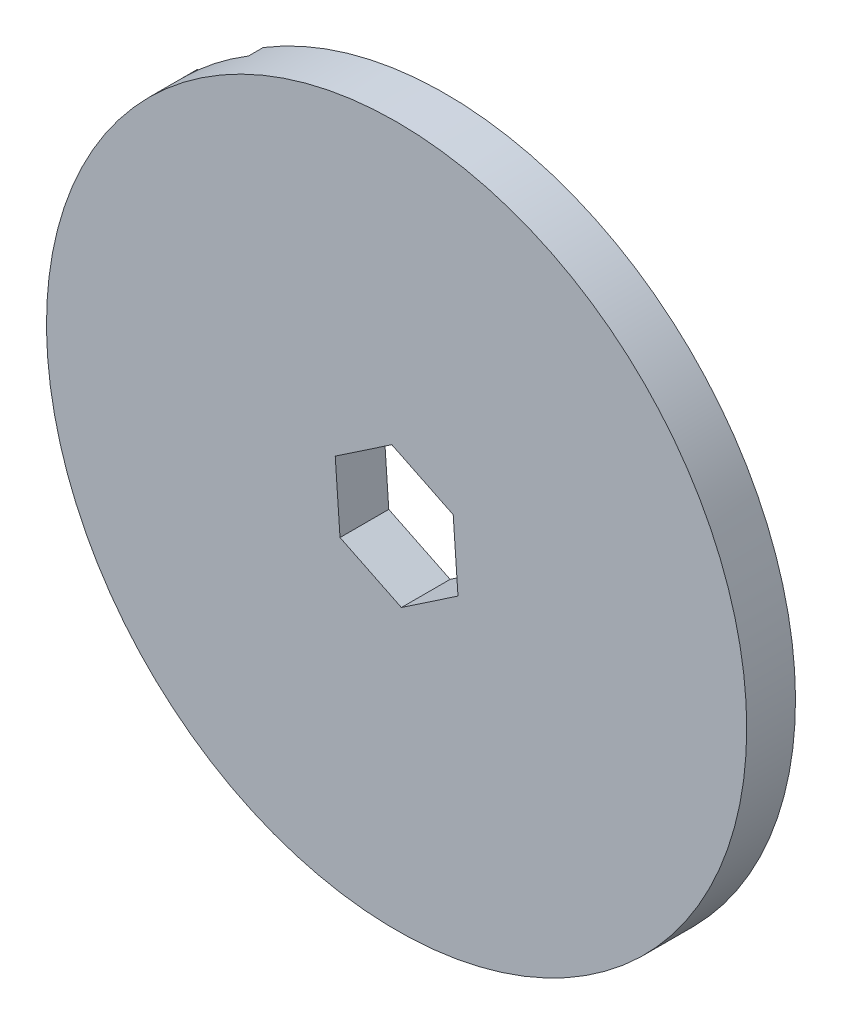
ISO-10303-21;
HEADER;
FILE_DESCRIPTION(('STEP AP214'),'2;1');
FILE_NAME('part.step','',(''),(''),'','','');
FILE_SCHEMA(('AUTOMOTIVE_DESIGN { 1 0 10303 214 1 1 1 1 }'));
ENDSEC;
DATA;
#1=APPLICATION_CONTEXT('core data for automotive mechanical design processes');
#2=APPLICATION_PROTOCOL_DEFINITION('international standard','automotive_design',2000,#1);
#3=PRODUCT_CONTEXT('',#1,'mechanical');
#4=PRODUCT('Part','Part','',(#3));
#5=PRODUCT_RELATED_PRODUCT_CATEGORY('part','',(#4));
#6=PRODUCT_DEFINITION_FORMATION('','',#4);
#7=PRODUCT_DEFINITION_CONTEXT('part definition',#1,'design');
#8=PRODUCT_DEFINITION('design','',#6,#7);
#9=PRODUCT_DEFINITION_SHAPE('','',#8);
#10=(LENGTH_UNIT() NAMED_UNIT(*) SI_UNIT(.MILLI.,.METRE.));
#11=(NAMED_UNIT(*) PLANE_ANGLE_UNIT() SI_UNIT($,.RADIAN.));
#12=(NAMED_UNIT(*) SI_UNIT($,.STERADIAN.) SOLID_ANGLE_UNIT());
#13=UNCERTAINTY_MEASURE_WITH_UNIT(LENGTH_MEASURE(1.E-05),#10,'distance_accuracy_value','');
#14=(GEOMETRIC_REPRESENTATION_CONTEXT(3) GLOBAL_UNCERTAINTY_ASSIGNED_CONTEXT((#13)) GLOBAL_UNIT_ASSIGNED_CONTEXT((#10,
#11,#12)) REPRESENTATION_CONTEXT('',''));
#15=CARTESIAN_POINT('',(0.,0.,0.));
#16=DIRECTION('',(0.,0.,1.));
#17=DIRECTION('',(1.,0.,0.));
#18=AXIS2_PLACEMENT_3D('',#15,#16,#17);
#19=CARTESIAN_POINT('',(0.,0.,5.));
#20=DIRECTION('',(0.,0.,1.));
#21=DIRECTION('',(1.,0.,0.));
#22=AXIS2_PLACEMENT_3D('',#19,#20,#21);
#23=PLANE('',#22);
#24=CARTESIAN_POINT('',(0.,0.,5.));
#25=DIRECTION('',(0.,0.,1.));
#26=DIRECTION('',(1.,0.,0.));
#27=AXIS2_PLACEMENT_3D('',#24,#25,#26);
#28=CIRCLE('',#27,35.9);
#29=CARTESIAN_POINT('',(35.9,0.,5.));
#30=VERTEX_POINT('',#29);
#31=EDGE_CURVE('E11',#30,#30,#28,.T.);
#32=ORIENTED_EDGE('',*,*,#31,.T.);
#33=EDGE_LOOP('',(#32));
#34=FACE_BOUND('',#33,.T.);
#35=DIRECTION('',(-0.0701147001181116,0.997538935995657,0.));
#36=VECTOR('',#35,1.);
#37=CARTESIAN_POINT('',(6.29265986926775,-3.06633849561771,5.));
#38=LINE('',#37,#36);
#39=CARTESIAN_POINT('',(6.29265986926775,-3.06633849561771,5.));
#40=VERTEX_POINT('',#39);
#41=CARTESIAN_POINT('',(5.80185696844097,3.91643405635189,5.));
#42=VERTEX_POINT('',#41);
#43=EDGE_CURVE('E202',#40,#42,#38,.T.);
#44=ORIENTED_EDGE('',*,*,#43,.F.);
#45=DIRECTION('',(0.828836709777282,0.559490579478841,0.));
#46=VECTOR('',#45,1.);
#47=CARTESIAN_POINT('',(0.490802900826781,-6.9827725519696,5.));
#48=LINE('',#47,#46);
#49=CARTESIAN_POINT('',(0.490802900826781,-6.9827725519696,5.));
#50=VERTEX_POINT('',#49);
#51=EDGE_CURVE('E200',#50,#40,#48,.T.);
#52=ORIENTED_EDGE('',*,*,#51,.F.);
#53=DIRECTION('',(0.898951409895394,-0.438048356516816,0.));
#54=VECTOR('',#53,1.);
#55=CARTESIAN_POINT('',(-5.80185696844098,-3.91643405635189,5.));
#56=LINE('',#55,#54);
#57=CARTESIAN_POINT('',(-5.80185696844098,-3.91643405635189,5.));
#58=VERTEX_POINT('',#57);
#59=EDGE_CURVE('E212',#58,#50,#56,.T.);
#60=ORIENTED_EDGE('',*,*,#59,.F.);
#61=DIRECTION('',(0.0701147001181116,-0.997538935995657,0.));
#62=VECTOR('',#61,1.);
#63=CARTESIAN_POINT('',(-6.29265986926776,3.06633849561771,5.));
#64=LINE('',#63,#62);
#65=CARTESIAN_POINT('',(-6.29265986926776,3.06633849561771,5.));
#66=VERTEX_POINT('',#65);
#67=EDGE_CURVE('E209',#66,#58,#64,.T.);
#68=ORIENTED_EDGE('',*,*,#67,.F.);
#69=DIRECTION('',(-0.828836709777282,-0.559490579478841,0.));
#70=VECTOR('',#69,1.);
#71=CARTESIAN_POINT('',(-0.490802900826782,6.9827725519696,5.));
#72=LINE('',#71,#70);
#73=CARTESIAN_POINT('',(-0.490802900826782,6.9827725519696,5.));
#74=VERTEX_POINT('',#73);
#75=EDGE_CURVE('E207',#74,#66,#72,.T.);
#76=ORIENTED_EDGE('',*,*,#75,.F.);
#77=DIRECTION('',(-0.898951409895394,0.438048356516816,0.));
#78=VECTOR('',#77,1.);
#79=CARTESIAN_POINT('',(5.80185696844097,3.91643405635189,5.));
#80=LINE('',#79,#78);
#81=EDGE_CURVE('E205',#42,#74,#80,.T.);
#82=ORIENTED_EDGE('',*,*,#81,.F.);
#83=EDGE_LOOP('',(#44,#52,#60,#68,#76,#82));
#84=FACE_BOUND('',#83,.T.);
#85=ADVANCED_FACE('F43',(#34,#84),#23,.T.);
#86=CARTESIAN_POINT('',(0.,0.,0.));
#87=DIRECTION('',(0.,0.,1.));
#88=DIRECTION('',(1.,0.,0.));
#89=AXIS2_PLACEMENT_3D('',#86,#87,#88);
#90=PLANE('',#89);
#91=CARTESIAN_POINT('',(0.,0.,0.));
#92=DIRECTION('',(0.,0.,1.));
#93=DIRECTION('',(1.,0.,0.));
#94=AXIS2_PLACEMENT_3D('',#91,#92,#93);
#95=CIRCLE('',#94,35.9);
#96=CARTESIAN_POINT('',(25.4038190708252,-25.3664340540167,0.));
#97=VERTEX_POINT('',#96);
#98=CARTESIAN_POINT('',(-18.6822614231694,30.6558821128402,0.));
#99=VERTEX_POINT('',#98);
#100=EDGE_CURVE('E243',#97,#99,#95,.T.);
#101=ORIENTED_EDGE('',*,*,#100,.F.);
#102=DIRECTION('',(0.676047817007071,-0.73685775365397,0.));
#103=VECTOR('',#102,1.);
#104=CARTESIAN_POINT('',(21.4105641636638,-21.0139892022823,0.));
#105=LINE('',#104,#103);
#106=CARTESIAN_POINT('',(21.4105641636638,-21.0139892022823,0.));
#107=VERTEX_POINT('',#106);
#108=EDGE_CURVE('E162',#107,#97,#105,.T.);
#109=ORIENTED_EDGE('',*,*,#108,.F.);
#110=CARTESIAN_POINT('',(0.,0.,0.));
#111=DIRECTION('',(0.,0.,1.));
#112=DIRECTION('',(-1.,0.,0.));
#113=AXIS2_PLACEMENT_3D('',#110,#111,#112);
#114=CIRCLE('',#113,30.);
#115=CARTESIAN_POINT('',(15.2421962619728,-25.8394166557897,0.));
#116=VERTEX_POINT('',#115);
#117=EDGE_CURVE('E266',#116,#107,#114,.T.);
#118=ORIENTED_EDGE('',*,*,#117,.F.);
#119=DIRECTION('',(-0.581208288475088,0.813754831265449,0.));
#120=VECTOR('',#119,1.);
#121=CARTESIAN_POINT('',(18.6822614231694,-30.6558821128402,0.));
#122=LINE('',#121,#120);
#123=CARTESIAN_POINT('',(18.6822614231694,-30.6558821128402,0.));
#124=VERTEX_POINT('',#123);
#125=EDGE_CURVE('E264',#124,#116,#122,.T.);
#126=ORIENTED_EDGE('',*,*,#125,.F.);
#127=CARTESIAN_POINT('',(-25.4038190708252,25.3664340540167,0.));
#128=VERTEX_POINT('',#127);
#129=EDGE_CURVE('E47',#128,#124,#95,.T.);
#130=ORIENTED_EDGE('',*,*,#129,.F.);
#131=DIRECTION('',(-0.676047817007071,0.73685775365397,0.));
#132=VECTOR('',#131,1.);
#133=CARTESIAN_POINT('',(-21.4105641636638,21.0139892022823,0.));
#134=LINE('',#133,#132);
#135=CARTESIAN_POINT('',(-21.4105641636638,21.0139892022823,0.));
#136=VERTEX_POINT('',#135);
#137=EDGE_CURVE('E176',#136,#128,#134,.T.);
#138=ORIENTED_EDGE('',*,*,#137,.F.);
#139=CARTESIAN_POINT('',(0.,0.,0.));
#140=DIRECTION('',(0.,0.,1.));
#141=DIRECTION('',(1.,0.,0.));
#142=AXIS2_PLACEMENT_3D('',#139,#140,#141);
#143=CIRCLE('',#142,30.);
#144=CARTESIAN_POINT('',(-15.2421962619728,25.8394166557897,0.));
#145=VERTEX_POINT('',#144);
#146=EDGE_CURVE('E186',#145,#136,#143,.T.);
#147=ORIENTED_EDGE('',*,*,#146,.F.);
#148=DIRECTION('',(0.581208288475088,-0.813754831265449,0.));
#149=VECTOR('',#148,1.);
#150=CARTESIAN_POINT('',(-18.6822614231694,30.6558821128402,0.));
#151=LINE('',#150,#149);
#152=EDGE_CURVE('E183',#99,#145,#151,.T.);
#153=ORIENTED_EDGE('',*,*,#152,.F.);
#154=EDGE_LOOP('',(#101,#109,#118,#126,#130,#138,#147,#153));
#155=FACE_BOUND('',#154,.T.);
#156=DIRECTION('',(0.828836709777282,0.559490579478841,0.));
#157=VECTOR('',#156,1.);
#158=CARTESIAN_POINT('',(0.490802900826781,-6.9827725519696,0.));
#159=LINE('',#158,#157);
#160=CARTESIAN_POINT('',(0.490802900826781,-6.9827725519696,0.));
#161=VERTEX_POINT('',#160);
#162=CARTESIAN_POINT('',(6.29265986926775,-3.06633849561771,0.));
#163=VERTEX_POINT('',#162);
#164=EDGE_CURVE('E193',#161,#163,#159,.T.);
#165=ORIENTED_EDGE('',*,*,#164,.T.);
#166=DIRECTION('',(-0.0701147001181116,0.997538935995657,0.));
#167=VECTOR('',#166,1.);
#168=CARTESIAN_POINT('',(6.29265986926775,-3.06633849561771,0.));
#169=LINE('',#168,#167);
#170=CARTESIAN_POINT('',(5.80185696844097,3.91643405635189,0.));
#171=VERTEX_POINT('',#170);
#172=EDGE_CURVE('E217',#163,#171,#169,.T.);
#173=ORIENTED_EDGE('',*,*,#172,.T.);
#174=DIRECTION('',(-0.898951409895394,0.438048356516816,0.));
#175=VECTOR('',#174,1.);
#176=CARTESIAN_POINT('',(5.80185696844097,3.91643405635189,0.));
#177=LINE('',#176,#175);
#178=CARTESIAN_POINT('',(-0.490802900826782,6.9827725519696,0.));
#179=VERTEX_POINT('',#178);
#180=EDGE_CURVE('E220',#171,#179,#177,.T.);
#181=ORIENTED_EDGE('',*,*,#180,.T.);
#182=DIRECTION('',(-0.828836709777282,-0.559490579478841,0.));
#183=VECTOR('',#182,1.);
#184=CARTESIAN_POINT('',(-0.490802900826782,6.9827725519696,0.));
#185=LINE('',#184,#183);
#186=CARTESIAN_POINT('',(-6.29265986926776,3.06633849561771,0.));
#187=VERTEX_POINT('',#186);
#188=EDGE_CURVE('E223',#179,#187,#185,.T.);
#189=ORIENTED_EDGE('',*,*,#188,.T.);
#190=DIRECTION('',(0.0701147001181116,-0.997538935995657,0.));
#191=VECTOR('',#190,1.);
#192=CARTESIAN_POINT('',(-6.29265986926776,3.06633849561771,0.));
#193=LINE('',#192,#191);
#194=CARTESIAN_POINT('',(-5.80185696844098,-3.91643405635189,0.));
#195=VERTEX_POINT('',#194);
#196=EDGE_CURVE('E226',#187,#195,#193,.T.);
#197=ORIENTED_EDGE('',*,*,#196,.T.);
#198=DIRECTION('',(0.898951409895394,-0.438048356516816,0.));
#199=VECTOR('',#198,1.);
#200=CARTESIAN_POINT('',(-5.80185696844098,-3.91643405635189,0.));
#201=LINE('',#200,#199);
#202=EDGE_CURVE('E203',#195,#161,#201,.T.);
#203=ORIENTED_EDGE('',*,*,#202,.T.);
#204=EDGE_LOOP('',(#165,#173,#181,#189,#197,#203));
#205=FACE_BOUND('',#204,.T.);
#206=ADVANCED_FACE('F255',(#155,#205),#90,.F.);
#207=CARTESIAN_POINT('',(0.,0.,5.));
#208=DIRECTION('',(0.,0.,-1.));
#209=DIRECTION('',(-1.,0.,0.));
#210=AXIS2_PLACEMENT_3D('',#207,#208,#209);
#211=CYLINDRICAL_SURFACE('',#210,35.9);
#212=ORIENTED_EDGE('',*,*,#31,.F.);
#213=EDGE_LOOP('',(#212));
#214=FACE_BOUND('',#213,.T.);
#215=CARTESIAN_POINT('',(0.,0.,1.5));
#216=DIRECTION('',(0.,0.,-1.));
#217=DIRECTION('',(-1.,0.,0.));
#218=AXIS2_PLACEMENT_3D('',#215,#216,#217);
#219=CIRCLE('',#218,35.9);
#220=CARTESIAN_POINT('',(25.4038190708252,-25.3664340540167,1.5));
#221=VERTEX_POINT('',#220);
#222=CARTESIAN_POINT('',(18.6822614231694,-30.6558821128402,1.5));
#223=VERTEX_POINT('',#222);
#224=EDGE_CURVE('E156',#221,#223,#219,.T.);
#225=ORIENTED_EDGE('',*,*,#224,.F.);
#226=DIRECTION('',(0.,0.,-1.));
#227=VECTOR('',#226,1.);
#228=CARTESIAN_POINT('',(25.4038190708252,-25.3664340540167,1.5));
#229=LINE('',#228,#227);
#230=EDGE_CURVE('E187',#221,#97,#229,.T.);
#231=ORIENTED_EDGE('',*,*,#230,.T.);
#232=ORIENTED_EDGE('',*,*,#100,.T.);
#233=DIRECTION('',(0.,0.,-1.));
#234=VECTOR('',#233,1.);
#235=CARTESIAN_POINT('',(-18.6822614231694,30.6558821128402,1.5));
#236=LINE('',#235,#234);
#237=CARTESIAN_POINT('',(-18.6822614231694,30.6558821128402,1.5));
#238=VERTEX_POINT('',#237);
#239=EDGE_CURVE('E182',#238,#99,#236,.T.);
#240=ORIENTED_EDGE('',*,*,#239,.F.);
#241=CARTESIAN_POINT('',(0.,0.,1.5));
#242=DIRECTION('',(0.,0.,-1.));
#243=DIRECTION('',(1.,0.,0.));
#244=AXIS2_PLACEMENT_3D('',#241,#242,#243);
#245=CIRCLE('',#244,35.9);
#246=CARTESIAN_POINT('',(-25.4038190708252,25.3664340540167,1.5));
#247=VERTEX_POINT('',#246);
#248=EDGE_CURVE('E173',#247,#238,#245,.T.);
#249=ORIENTED_EDGE('',*,*,#248,.F.);
#250=DIRECTION('',(0.,0.,-1.));
#251=VECTOR('',#250,1.);
#252=CARTESIAN_POINT('',(-25.4038190708252,25.3664340540167,1.5));
#253=LINE('',#252,#251);
#254=EDGE_CURVE('E191',#247,#128,#253,.T.);
#255=ORIENTED_EDGE('',*,*,#254,.T.);
#256=ORIENTED_EDGE('',*,*,#129,.T.);
#257=DIRECTION('',(0.,0.,-1.));
#258=VECTOR('',#257,1.);
#259=CARTESIAN_POINT('',(18.6822614231694,-30.6558821128402,1.5));
#260=LINE('',#259,#258);
#261=EDGE_CURVE('E151',#223,#124,#260,.T.);
#262=ORIENTED_EDGE('',*,*,#261,.F.);
#263=EDGE_LOOP('',(#225,#231,#232,#240,#249,#255,#256,#262));
#264=FACE_BOUND('',#263,.T.);
#265=ADVANCED_FACE('F45',(#214,#264),#211,.T.);
#266=CARTESIAN_POINT('',(0.490802900826781,-6.9827725519696,5.));
#267=DIRECTION('',(-0.559490579478841,0.828836709777282,0.));
#268=DIRECTION('',(-0.828836709777282,-0.559490579478841,0.));
#269=AXIS2_PLACEMENT_3D('',#266,#267,#268);
#270=PLANE('',#269);
#271=ORIENTED_EDGE('',*,*,#164,.F.);
#272=DIRECTION('',(0.,0.,-1.));
#273=VECTOR('',#272,1.);
#274=CARTESIAN_POINT('',(0.490802900826781,-6.9827725519696,5.));
#275=LINE('',#274,#273);
#276=EDGE_CURVE('E214',#50,#161,#275,.T.);
#277=ORIENTED_EDGE('',*,*,#276,.F.);
#278=ORIENTED_EDGE('',*,*,#51,.T.);
#279=DIRECTION('',(0.,0.,-1.));
#280=VECTOR('',#279,1.);
#281=CARTESIAN_POINT('',(6.29265986926775,-3.06633849561771,5.));
#282=LINE('',#281,#280);
#283=EDGE_CURVE('E241',#40,#163,#282,.T.);
#284=ORIENTED_EDGE('',*,*,#283,.T.);
#285=EDGE_LOOP('',(#271,#277,#278,#284));
#286=FACE_BOUND('',#285,.T.);
#287=ADVANCED_FACE('F293',(#286),#270,.T.);
#288=CARTESIAN_POINT('',(6.29265986926775,-3.06633849561771,5.));
#289=DIRECTION('',(-0.997538935995657,-0.0701147001181116,0.));
#290=DIRECTION('',(0.0701147001181116,-0.997538935995657,0.));
#291=AXIS2_PLACEMENT_3D('',#288,#289,#290);
#292=PLANE('',#291);
#293=ORIENTED_EDGE('',*,*,#172,.F.);
#294=ORIENTED_EDGE('',*,*,#283,.F.);
#295=ORIENTED_EDGE('',*,*,#43,.T.);
#296=DIRECTION('',(0.,0.,-1.));
#297=VECTOR('',#296,1.);
#298=CARTESIAN_POINT('',(5.80185696844097,3.91643405635189,5.));
#299=LINE('',#298,#297);
#300=EDGE_CURVE('E239',#42,#171,#299,.T.);
#301=ORIENTED_EDGE('',*,*,#300,.T.);
#302=EDGE_LOOP('',(#293,#294,#295,#301));
#303=FACE_BOUND('',#302,.T.);
#304=ADVANCED_FACE('F295',(#303),#292,.T.);
#305=CARTESIAN_POINT('',(5.80185696844097,3.91643405635189,5.));
#306=DIRECTION('',(-0.438048356516816,-0.898951409895394,0.));
#307=DIRECTION('',(0.898951409895394,-0.438048356516816,0.));
#308=AXIS2_PLACEMENT_3D('',#305,#306,#307);
#309=PLANE('',#308);
#310=ORIENTED_EDGE('',*,*,#180,.F.);
#311=ORIENTED_EDGE('',*,*,#300,.F.);
#312=ORIENTED_EDGE('',*,*,#81,.T.);
#313=DIRECTION('',(0.,0.,-1.));
#314=VECTOR('',#313,1.);
#315=CARTESIAN_POINT('',(-0.490802900826782,6.9827725519696,5.));
#316=LINE('',#315,#314);
#317=EDGE_CURVE('E237',#74,#179,#316,.T.);
#318=ORIENTED_EDGE('',*,*,#317,.T.);
#319=EDGE_LOOP('',(#310,#311,#312,#318));
#320=FACE_BOUND('',#319,.T.);
#321=ADVANCED_FACE('F298',(#320),#309,.T.);
#322=CARTESIAN_POINT('',(-0.490802900826782,6.9827725519696,5.));
#323=DIRECTION('',(0.559490579478841,-0.828836709777282,0.));
#324=DIRECTION('',(0.828836709777282,0.559490579478841,0.));
#325=AXIS2_PLACEMENT_3D('',#322,#323,#324);
#326=PLANE('',#325);
#327=ORIENTED_EDGE('',*,*,#188,.F.);
#328=ORIENTED_EDGE('',*,*,#317,.F.);
#329=ORIENTED_EDGE('',*,*,#75,.T.);
#330=DIRECTION('',(0.,0.,-1.));
#331=VECTOR('',#330,1.);
#332=CARTESIAN_POINT('',(-6.29265986926776,3.06633849561771,5.));
#333=LINE('',#332,#331);
#334=EDGE_CURVE('E235',#66,#187,#333,.T.);
#335=ORIENTED_EDGE('',*,*,#334,.T.);
#336=EDGE_LOOP('',(#327,#328,#329,#335));
#337=FACE_BOUND('',#336,.T.);
#338=ADVANCED_FACE('F302',(#337),#326,.T.);
#339=CARTESIAN_POINT('',(-6.29265986926776,3.06633849561771,5.));
#340=DIRECTION('',(0.997538935995657,0.0701147001181117,0.));
#341=DIRECTION('',(-0.0701147001181117,0.997538935995657,0.));
#342=AXIS2_PLACEMENT_3D('',#339,#340,#341);
#343=PLANE('',#342);
#344=ORIENTED_EDGE('',*,*,#196,.F.);
#345=ORIENTED_EDGE('',*,*,#334,.F.);
#346=ORIENTED_EDGE('',*,*,#67,.T.);
#347=DIRECTION('',(0.,0.,-1.));
#348=VECTOR('',#347,1.);
#349=CARTESIAN_POINT('',(-5.80185696844098,-3.91643405635189,5.));
#350=LINE('',#349,#348);
#351=EDGE_CURVE('E233',#58,#195,#350,.T.);
#352=ORIENTED_EDGE('',*,*,#351,.T.);
#353=EDGE_LOOP('',(#344,#345,#346,#352));
#354=FACE_BOUND('',#353,.T.);
#355=ADVANCED_FACE('F306',(#354),#343,.T.);
#356=CARTESIAN_POINT('',(-5.80185696844098,-3.91643405635189,5.));
#357=DIRECTION('',(0.438048356516816,0.898951409895394,0.));
#358=DIRECTION('',(-0.898951409895394,0.438048356516816,0.));
#359=AXIS2_PLACEMENT_3D('',#356,#357,#358);
#360=PLANE('',#359);
#361=ORIENTED_EDGE('',*,*,#202,.F.);
#362=ORIENTED_EDGE('',*,*,#351,.F.);
#363=ORIENTED_EDGE('',*,*,#59,.T.);
#364=ORIENTED_EDGE('',*,*,#276,.T.);
#365=EDGE_LOOP('',(#361,#362,#363,#364));
#366=FACE_BOUND('',#365,.T.);
#367=ADVANCED_FACE('F310',(#366),#360,.T.);
#368=CARTESIAN_POINT('',(-21.4105641636638,21.0139892022823,1.5));
#369=DIRECTION('',(-0.73685775365397,-0.676047817007071,0.));
#370=DIRECTION('',(0.676047817007071,-0.73685775365397,0.));
#371=AXIS2_PLACEMENT_3D('',#368,#369,#370);
#372=PLANE('',#371);
#373=ORIENTED_EDGE('',*,*,#137,.T.);
#374=ORIENTED_EDGE('',*,*,#254,.F.);
#375=DIRECTION('',(-0.676047817007071,0.73685775365397,0.));
#376=VECTOR('',#375,1.);
#377=CARTESIAN_POINT('',(-21.4105641636638,21.0139892022823,1.5));
#378=LINE('',#377,#376);
#379=CARTESIAN_POINT('',(-21.4105641636638,21.0139892022823,1.5));
#380=VERTEX_POINT('',#379);
#381=EDGE_CURVE('E66',#380,#247,#378,.T.);
#382=ORIENTED_EDGE('',*,*,#381,.F.);
#383=DIRECTION('',(0.,0.,-1.));
#384=VECTOR('',#383,1.);
#385=CARTESIAN_POINT('',(-21.4105641636638,21.0139892022823,1.5));
#386=LINE('',#385,#384);
#387=EDGE_CURVE('E194',#380,#136,#386,.T.);
#388=ORIENTED_EDGE('',*,*,#387,.T.);
#389=EDGE_LOOP('',(#373,#374,#382,#388));
#390=FACE_BOUND('',#389,.T.);
#391=ADVANCED_FACE('F314',(#390),#372,.F.);
#392=CARTESIAN_POINT('',(0.,0.,1.5));
#393=DIRECTION('',(0.,0.,-1.));
#394=DIRECTION('',(-1.,0.,0.));
#395=AXIS2_PLACEMENT_3D('',#392,#393,#394);
#396=CYLINDRICAL_SURFACE('',#395,30.);
#397=ORIENTED_EDGE('',*,*,#146,.T.);
#398=ORIENTED_EDGE('',*,*,#387,.F.);
#399=CARTESIAN_POINT('',(0.,0.,1.5));
#400=DIRECTION('',(0.,0.,1.));
#401=DIRECTION('',(1.,0.,0.));
#402=AXIS2_PLACEMENT_3D('',#399,#400,#401);
#403=CIRCLE('',#402,30.);
#404=CARTESIAN_POINT('',(-15.2421962619728,25.8394166557897,1.5));
#405=VERTEX_POINT('',#404);
#406=EDGE_CURVE('E179',#405,#380,#403,.T.);
#407=ORIENTED_EDGE('',*,*,#406,.F.);
#408=DIRECTION('',(0.,0.,-1.));
#409=VECTOR('',#408,1.);
#410=CARTESIAN_POINT('',(-15.2421962619728,25.8394166557897,1.5));
#411=LINE('',#410,#409);
#412=EDGE_CURVE('E196',#405,#145,#411,.T.);
#413=ORIENTED_EDGE('',*,*,#412,.T.);
#414=EDGE_LOOP('',(#397,#398,#407,#413));
#415=FACE_BOUND('',#414,.T.);
#416=ADVANCED_FACE('F259',(#415),#396,.T.);
#417=CARTESIAN_POINT('',(-18.6822614231694,30.6558821128402,1.5));
#418=DIRECTION('',(0.813754831265449,0.581208288475088,0.));
#419=DIRECTION('',(-0.581208288475088,0.813754831265449,0.));
#420=AXIS2_PLACEMENT_3D('',#417,#418,#419);
#421=PLANE('',#420);
#422=ORIENTED_EDGE('',*,*,#152,.T.);
#423=ORIENTED_EDGE('',*,*,#412,.F.);
#424=DIRECTION('',(0.581208288475088,-0.813754831265449,0.));
#425=VECTOR('',#424,1.);
#426=CARTESIAN_POINT('',(-18.6822614231694,30.6558821128402,1.5));
#427=LINE('',#426,#425);
#428=EDGE_CURVE('E175',#238,#405,#427,.T.);
#429=ORIENTED_EDGE('',*,*,#428,.F.);
#430=ORIENTED_EDGE('',*,*,#239,.T.);
#431=EDGE_LOOP('',(#422,#423,#429,#430));
#432=FACE_BOUND('',#431,.T.);
#433=ADVANCED_FACE('F253',(#432),#421,.F.);
#434=CARTESIAN_POINT('',(0.,0.,1.5));
#435=DIRECTION('',(0.,0.,1.));
#436=DIRECTION('',(1.,0.,0.));
#437=AXIS2_PLACEMENT_3D('',#434,#435,#436);
#438=PLANE('',#437);
#439=ORIENTED_EDGE('',*,*,#248,.T.);
#440=ORIENTED_EDGE('',*,*,#428,.T.);
#441=ORIENTED_EDGE('',*,*,#406,.T.);
#442=ORIENTED_EDGE('',*,*,#381,.T.);
#443=EDGE_LOOP('',(#439,#440,#441,#442));
#444=FACE_BOUND('',#443,.T.);
#445=ADVANCED_FACE('F261',(#444),#438,.F.);
#446=CARTESIAN_POINT('',(21.4105641636638,-21.0139892022823,1.5));
#447=DIRECTION('',(0.73685775365397,0.676047817007071,0.));
#448=DIRECTION('',(-0.676047817007071,0.73685775365397,0.));
#449=AXIS2_PLACEMENT_3D('',#446,#447,#448);
#450=PLANE('',#449);
#451=ORIENTED_EDGE('',*,*,#108,.T.);
#452=ORIENTED_EDGE('',*,*,#230,.F.);
#453=DIRECTION('',(0.676047817007071,-0.73685775365397,0.));
#454=VECTOR('',#453,1.);
#455=CARTESIAN_POINT('',(21.4105641636638,-21.0139892022823,1.5));
#456=LINE('',#455,#454);
#457=CARTESIAN_POINT('',(21.4105641636638,-21.0139892022823,1.5));
#458=VERTEX_POINT('',#457);
#459=EDGE_CURVE('E58',#458,#221,#456,.T.);
#460=ORIENTED_EDGE('',*,*,#459,.F.);
#461=DIRECTION('',(0.,0.,-1.));
#462=VECTOR('',#461,1.);
#463=CARTESIAN_POINT('',(21.4105641636638,-21.0139892022823,1.5));
#464=LINE('',#463,#462);
#465=EDGE_CURVE('E168',#458,#107,#464,.T.);
#466=ORIENTED_EDGE('',*,*,#465,.T.);
#467=EDGE_LOOP('',(#451,#452,#460,#466));
#468=FACE_BOUND('',#467,.T.);
#469=ADVANCED_FACE('F273',(#468),#450,.F.);
#470=CARTESIAN_POINT('',(0.,0.,1.5));
#471=DIRECTION('',(0.,0.,-1.));
#472=DIRECTION('',(-1.,0.,0.));
#473=AXIS2_PLACEMENT_3D('',#470,#471,#472);
#474=CYLINDRICAL_SURFACE('',#473,30.);
#475=ORIENTED_EDGE('',*,*,#117,.T.);
#476=ORIENTED_EDGE('',*,*,#465,.F.);
#477=CARTESIAN_POINT('',(0.,0.,1.5));
#478=DIRECTION('',(0.,0.,1.));
#479=DIRECTION('',(-1.,0.,0.));
#480=AXIS2_PLACEMENT_3D('',#477,#478,#479);
#481=CIRCLE('',#480,30.);
#482=CARTESIAN_POINT('',(15.2421962619728,-25.8394166557897,1.5));
#483=VERTEX_POINT('',#482);
#484=EDGE_CURVE('E155',#483,#458,#481,.T.);
#485=ORIENTED_EDGE('',*,*,#484,.F.);
#486=DIRECTION('',(0.,0.,-1.));
#487=VECTOR('',#486,1.);
#488=CARTESIAN_POINT('',(15.2421962619728,-25.8394166557897,1.5));
#489=LINE('',#488,#487);
#490=EDGE_CURVE('E153',#483,#116,#489,.T.);
#491=ORIENTED_EDGE('',*,*,#490,.T.);
#492=EDGE_LOOP('',(#475,#476,#485,#491));
#493=FACE_BOUND('',#492,.T.);
#494=ADVANCED_FACE('F275',(#493),#474,.T.);
#495=CARTESIAN_POINT('',(18.6822614231694,-30.6558821128402,1.5));
#496=DIRECTION('',(-0.813754831265449,-0.581208288475088,0.));
#497=DIRECTION('',(0.581208288475088,-0.813754831265449,0.));
#498=AXIS2_PLACEMENT_3D('',#495,#496,#497);
#499=PLANE('',#498);
#500=ORIENTED_EDGE('',*,*,#125,.T.);
#501=ORIENTED_EDGE('',*,*,#490,.F.);
#502=DIRECTION('',(-0.581208288475088,0.813754831265449,0.));
#503=VECTOR('',#502,1.);
#504=CARTESIAN_POINT('',(18.6822614231694,-30.6558821128402,1.5));
#505=LINE('',#504,#503);
#506=EDGE_CURVE('E147',#223,#483,#505,.T.);
#507=ORIENTED_EDGE('',*,*,#506,.F.);
#508=ORIENTED_EDGE('',*,*,#261,.T.);
#509=EDGE_LOOP('',(#500,#501,#507,#508));
#510=FACE_BOUND('',#509,.T.);
#511=ADVANCED_FACE('F149',(#510),#499,.F.);
#512=CARTESIAN_POINT('',(0.,0.,1.5));
#513=DIRECTION('',(0.,0.,1.));
#514=DIRECTION('',(-1.,0.,0.));
#515=AXIS2_PLACEMENT_3D('',#512,#513,#514);
#516=PLANE('',#515);
#517=ORIENTED_EDGE('',*,*,#224,.T.);
#518=ORIENTED_EDGE('',*,*,#506,.T.);
#519=ORIENTED_EDGE('',*,*,#484,.T.);
#520=ORIENTED_EDGE('',*,*,#459,.T.);
#521=EDGE_LOOP('',(#517,#518,#519,#520));
#522=FACE_BOUND('',#521,.T.);
#523=ADVANCED_FACE('F159',(#522),#516,.F.);
#524=CLOSED_SHELL('',(#85,#206,#265,#287,#304,#321,#338,#355,#367,#391,#416,#433,#445,#469,#494,
#511,#523));
#525=MANIFOLD_SOLID_BREP('B2',#524);
#526=ADVANCED_BREP_SHAPE_REPRESENTATION('',(#18,#525),#14);
#527=SHAPE_DEFINITION_REPRESENTATION(#9,#526);
ENDSEC;
END-ISO-10303-21;
